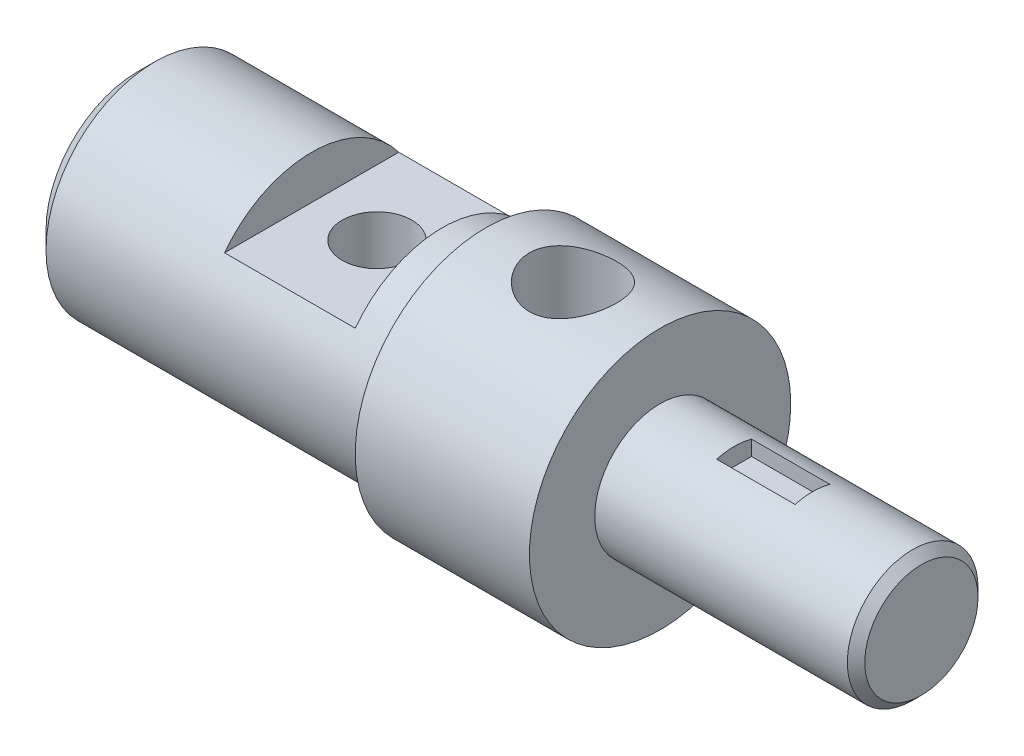
ISO-10303-21;
HEADER;
FILE_DESCRIPTION(('STEP AP214'),'2;1');
FILE_NAME('part.step','',(''),(''),'','','');
FILE_SCHEMA(('AUTOMOTIVE_DESIGN { 1 0 10303 214 1 1 1 1 }'));
ENDSEC;
DATA;
#1=APPLICATION_CONTEXT('core data for automotive mechanical design processes');
#2=APPLICATION_PROTOCOL_DEFINITION('international standard','automotive_design',2000,#1);
#3=PRODUCT_CONTEXT('',#1,'mechanical');
#4=PRODUCT('Part','Part','',(#3));
#5=PRODUCT_RELATED_PRODUCT_CATEGORY('part','',(#4));
#6=PRODUCT_DEFINITION_FORMATION('','',#4);
#7=PRODUCT_DEFINITION_CONTEXT('part definition',#1,'design');
#8=PRODUCT_DEFINITION('design','',#6,#7);
#9=PRODUCT_DEFINITION_SHAPE('','',#8);
#10=(LENGTH_UNIT() NAMED_UNIT(*) SI_UNIT(.MILLI.,.METRE.));
#11=(NAMED_UNIT(*) PLANE_ANGLE_UNIT() SI_UNIT($,.RADIAN.));
#12=(NAMED_UNIT(*) SI_UNIT($,.STERADIAN.) SOLID_ANGLE_UNIT());
#13=UNCERTAINTY_MEASURE_WITH_UNIT(LENGTH_MEASURE(1.E-05),#10,'distance_accuracy_value','');
#14=(GEOMETRIC_REPRESENTATION_CONTEXT(3) GLOBAL_UNCERTAINTY_ASSIGNED_CONTEXT((#13)) GLOBAL_UNIT_ASSIGNED_CONTEXT((#10,
#11,#12)) REPRESENTATION_CONTEXT('',''));
#15=CARTESIAN_POINT('',(0.,0.,0.));
#16=DIRECTION('',(0.,0.,1.));
#17=DIRECTION('',(1.,0.,0.));
#18=AXIS2_PLACEMENT_3D('',#15,#16,#17);
#19=CARTESIAN_POINT('',(0.,0.,0.));
#20=DIRECTION('',(-1.,0.,0.));
#21=DIRECTION('',(0.,0.,1.));
#22=AXIS2_PLACEMENT_3D('',#19,#20,#21);
#23=PLANE('',#22);
#24=CARTESIAN_POINT('',(0.,0.,0.));
#25=DIRECTION('',(-1.,0.,0.));
#26=DIRECTION('',(0.,0.,1.));
#27=AXIS2_PLACEMENT_3D('',#24,#25,#26);
#28=CIRCLE('',#27,21.);
#29=CARTESIAN_POINT('',(0.,0.,21.));
#30=VERTEX_POINT('',#29);
#31=EDGE_CURVE('E11',#30,#30,#28,.T.);
#32=ORIENTED_EDGE('',*,*,#31,.T.);
#33=EDGE_LOOP('',(#32));
#34=FACE_BOUND('',#33,.T.);
#35=ADVANCED_FACE('F32',(#34),#23,.T.);
#36=CARTESIAN_POINT('',(0.,0.,0.));
#37=DIRECTION('',(1.,0.,0.));
#38=DIRECTION('',(0.,0.,-1.));
#39=AXIS2_PLACEMENT_3D('',#36,#37,#38);
#40=CYLINDRICAL_SURFACE('',#39,25.);
#41=CARTESIAN_POINT('',(4.00000000000003,0.,0.));
#42=DIRECTION('',(-1.,0.,0.));
#43=DIRECTION('',(0.,0.,1.));
#44=AXIS2_PLACEMENT_3D('',#41,#42,#43);
#45=CIRCLE('',#44,25.);
#46=CARTESIAN_POINT('',(4.00000000000003,0.,25.));
#47=VERTEX_POINT('',#46);
#48=EDGE_CURVE('E40',#47,#47,#45,.F.);
#49=ORIENTED_EDGE('',*,*,#48,.T.);
#50=EDGE_LOOP('',(#49));
#51=FACE_BOUND('',#50,.T.);
#52=CARTESIAN_POINT('',(55.,-23.685438564654,8.00000000000001));
#53=CARTESIAN_POINT('',(54.7815803575144,-23.6854386808648,7.99999984957895));
#54=CARTESIAN_POINT('',(54.5631583241206,-23.6884680732668,7.99104739522468));
#55=CARTESIAN_POINT('',(54.1279420480163,-23.7004886386032,7.95532466127356));
#56=CARTESIAN_POINT('',(53.9111478298571,-23.7094799012743,7.92855411348258));
#57=CARTESIAN_POINT('',(53.4807765209476,-23.7331386878374,7.85745049211899));
#58=CARTESIAN_POINT('',(53.2671994309225,-23.7478062130085,7.81311741458832));
#59=CARTESIAN_POINT('',(52.8446965225023,-23.7823668675693,7.70727713375418));
#60=CARTESIAN_POINT('',(52.6357725455734,-23.8022620272859,7.64576325712626));
#61=CARTESIAN_POINT('',(52.2245298568912,-23.8466255896338,7.50625010454698));
#62=CARTESIAN_POINT('',(52.0221972775799,-23.8710835495518,7.42828841980156));
#63=CARTESIAN_POINT('',(51.6249122191686,-23.9238870822497,7.25642411726833));
#64=CARTESIAN_POINT('',(51.4299625574611,-23.9522341204386,7.16251548746745));
#65=CARTESIAN_POINT('',(50.8581469336224,-24.0419138600675,6.85793629516375));
#66=CARTESIAN_POINT('',(50.493962319828,-24.1079252956509,6.62429224651447));
#67=CARTESIAN_POINT('',(49.7973644234584,-24.2476140916892,6.09348517787802));
#68=CARTESIAN_POINT('',(49.466378758206,-24.3214714988789,5.7944955492848));
#69=CARTESIAN_POINT('',(49.010501101048,-24.4305604336787,5.30805806180979));
#70=CARTESIAN_POINT('',(48.8652345031396,-24.4666614836583,5.13947531148956));
#71=CARTESIAN_POINT('',(48.5891239511144,-24.5373497989682,4.79062429786665));
#72=CARTESIAN_POINT('',(48.4582746042002,-24.5719376273827,4.61036044424484));
#73=CARTESIAN_POINT('',(48.2088922034705,-24.6394882013786,4.2347279729649));
#74=CARTESIAN_POINT('',(48.0907355340008,-24.6723910632087,4.03909881022464));
#75=CARTESIAN_POINT('',(47.8714280071339,-24.7347020758086,3.63808475977613));
#76=CARTESIAN_POINT('',(47.7702708731147,-24.7641115152498,3.43270350884649));
#77=CARTESIAN_POINT('',(47.5857545385277,-24.8186071657323,3.01353634546636));
#78=CARTESIAN_POINT('',(47.5023954108645,-24.8436933590644,2.79975039859258));
#79=CARTESIAN_POINT('',(47.3542239569391,-24.8888108707868,2.36532685435552));
#80=CARTESIAN_POINT('',(47.2894109035082,-24.9088423873611,2.14468952600256));
#81=CARTESIAN_POINT('',(47.180728925036,-24.9427027645633,1.70544007064569));
#82=CARTESIAN_POINT('',(47.1362519370392,-24.956710833976,1.48699212530629));
#83=CARTESIAN_POINT('',(47.0656605262099,-24.9790435892772,1.04686465468346));
#84=CARTESIAN_POINT('',(47.0395454311426,-24.9873684832283,0.825185248008189));
#85=CARTESIAN_POINT('',(47.0059330560568,-24.9980969713181,0.380320164500186));
#86=CARTESIAN_POINT('',(46.9984321156355,-25.0005017296283,0.157134792466882));
#87=CARTESIAN_POINT('',(47.0021118069011,-24.9993242178161,-0.28906365753733));
#88=CARTESIAN_POINT('',(47.0132920435224,-24.9957420743034,-0.512076739052016));
#89=CARTESIAN_POINT('',(47.0534758054651,-24.9829322363409,-0.948121459241209));
#90=CARTESIAN_POINT('',(47.0818155131301,-24.9739148611172,-1.16122085959996));
#91=CARTESIAN_POINT('',(47.1554934591184,-24.9506525224548,-1.5842429569984));
#92=CARTESIAN_POINT('',(47.2008373589439,-24.9364058179578,-1.79416457175747));
#93=CARTESIAN_POINT('',(47.3081123786972,-24.9030628614678,-2.20925418899823));
#94=CARTESIAN_POINT('',(47.3700381560653,-24.8839681715628,-2.41442369948073));
#95=CARTESIAN_POINT('',(47.5099985337709,-24.8414105650832,-2.81880756880318));
#96=CARTESIAN_POINT('',(47.588039204788,-24.8179460026514,-3.01801965093511));
#97=CARTESIAN_POINT('',(47.7606557370643,-24.7669381755912,-3.41154230115595));
#98=CARTESIAN_POINT('',(47.8554216336045,-24.7393486620652,-3.6057634723955));
#99=CARTESIAN_POINT('',(48.0601508039592,-24.681002406741,-3.98560664410535));
#100=CARTESIAN_POINT('',(48.170119284338,-24.6502445807863,-4.17122566931733));
#101=CARTESIAN_POINT('',(48.4044713517015,-24.5863436093405,-4.53270352451581));
#102=CARTESIAN_POINT('',(48.5288555731446,-24.5532003588876,-4.70856192441846));
#103=CARTESIAN_POINT('',(48.7912304060849,-24.4853581392628,-5.04950040506669));
#104=CARTESIAN_POINT('',(48.9292214723438,-24.4506591181159,-5.21458012526541));
#105=CARTESIAN_POINT('',(49.224294765057,-24.3790361534028,-5.53999615080865));
#106=CARTESIAN_POINT('',(49.3819484959968,-24.3420813307925,-5.69980789139332));
#107=CARTESIAN_POINT('',(49.7101016069825,-24.2684460367681,-6.00560235549347));
#108=CARTESIAN_POINT('',(49.8805969015458,-24.2317654821453,-6.15158944417049));
#109=CARTESIAN_POINT('',(50.233509153091,-24.1596686679399,-6.42891535142167));
#110=CARTESIAN_POINT('',(50.415932066845,-24.1242530539452,-6.56024676080872));
#111=CARTESIAN_POINT('',(50.7914143392303,-24.055729897642,-6.80722281220515));
#112=CARTESIAN_POINT('',(50.9844695103839,-24.0226214581356,-6.92287356873054));
#113=CARTESIAN_POINT('',(51.3825721713507,-23.9592714476214,-7.13905927828408));
#114=CARTESIAN_POINT('',(51.5877408210363,-23.9290716234423,-7.23938361928213));
#115=CARTESIAN_POINT('',(52.0063215593138,-23.8729789265058,-7.42226578397705));
#116=CARTESIAN_POINT('',(52.2197302130904,-23.8470842825312,-7.50483091821093));
#117=CARTESIAN_POINT('',(52.6533276958522,-23.800429138452,-7.65150322946081));
#118=CARTESIAN_POINT('',(52.8735158493688,-23.7796681287125,-7.71561223878846));
#119=CARTESIAN_POINT('',(53.3190300716208,-23.743975529647,-7.82476399336434));
#120=CARTESIAN_POINT('',(53.5443558995329,-23.7290436676779,-7.86980763035373));
#121=CARTESIAN_POINT('',(53.9888409338644,-23.7060174995229,-7.93889170576141));
#122=CARTESIAN_POINT('',(54.2078622710117,-23.697662621809,-7.96373400113701));
#123=CARTESIAN_POINT('',(54.6473536397787,-23.6870451499325,-7.99525936903906));
#124=CARTESIAN_POINT('',(54.8678236307973,-23.6847823857512,-8.00194294833893));
#125=CARTESIAN_POINT('',(55.3085057308031,-23.6864229191965,-7.99708539580729));
#126=CARTESIAN_POINT('',(55.5287178729785,-23.6903253090695,-7.98554694697623));
#127=CARTESIAN_POINT('',(55.9672481872955,-23.7041671395069,-7.94436471462869));
#128=CARTESIAN_POINT('',(56.1855663793959,-23.7141065163736,-7.91472112214365));
#129=CARTESIAN_POINT('',(56.6119579936969,-23.7393032496007,-7.83881510596476));
#130=CARTESIAN_POINT('',(56.8201390515345,-23.7543859299533,-7.7930971836533));
#131=CARTESIAN_POINT('',(57.2318764618395,-23.7894762366902,-7.68531262760813));
#132=CARTESIAN_POINT('',(57.4354311436776,-23.8094856122303,-7.62324018687687));
#133=CARTESIAN_POINT('',(57.8364795153303,-23.8538445483664,-7.48328019357438));
#134=CARTESIAN_POINT('',(58.0339746556081,-23.878193060658,-7.40539646026721));
#135=CARTESIAN_POINT('',(58.4218204691984,-23.9305644078881,-7.23436820024294));
#136=CARTESIAN_POINT('',(58.612168399891,-23.9585886351545,-7.14121788732929));
#137=CARTESIAN_POINT('',(58.9900122130826,-24.0184175302227,-6.93737893981404));
#138=CARTESIAN_POINT('',(59.1772595043725,-24.0503091521117,-6.82625501208183));
#139=CARTESIAN_POINT('',(59.541870176719,-24.1163102267659,-6.58928737769675));
#140=CARTESIAN_POINT('',(59.719230112405,-24.1504204437669,-6.46343858673973));
#141=CARTESIAN_POINT('',(60.0629783261203,-24.219938268401,-6.19785668923714));
#142=CARTESIAN_POINT('',(60.2293658236983,-24.2553459680439,-6.05812259682145));
#143=CARTESIAN_POINT('',(60.5501889981145,-24.3265313336776,-5.76563306048304));
#144=CARTESIAN_POINT('',(60.7046244286207,-24.3623090072765,-5.6128773483211));
#145=CARTESIAN_POINT('',(61.0071453658597,-24.4348785274942,-5.28824824864535));
#146=CARTESIAN_POINT('',(61.1546520501366,-24.4716456851727,-5.11582929367889));
#147=CARTESIAN_POINT('',(61.4345900130402,-24.5435459979084,-4.75893573036775));
#148=CARTESIAN_POINT('',(61.5670263520449,-24.5786796990962,-4.57446520169249));
#149=CARTESIAN_POINT('',(61.8159796685336,-24.646363217685,-4.19452275928064));
#150=CARTESIAN_POINT('',(61.9324907444746,-24.6789120753393,-3.99904680486517));
#151=CARTESIAN_POINT('',(62.1485921125172,-24.7404858816269,-3.59852554329833));
#152=CARTESIAN_POINT('',(62.2481894527291,-24.7695122966486,-3.39348426773368));
#153=CARTESIAN_POINT('',(62.4290834785191,-24.8230510612467,-2.97657551943914));
#154=CARTESIAN_POINT('',(62.5104991135776,-24.8475925480298,-2.76476344195047));
#155=CARTESIAN_POINT('',(62.6551364957877,-24.8916927648829,-2.33459892745281));
#156=CARTESIAN_POINT('',(62.7183654471358,-24.9112534676118,-2.11624911815011));
#157=CARTESIAN_POINT('',(62.8260771739683,-24.9448363955662,-1.67456921077645));
#158=CARTESIAN_POINT('',(62.8705613544624,-24.9588590358908,-1.4512394872954));
#159=CARTESIAN_POINT('',(62.9403519065489,-24.9809545215066,-1.00131466158616));
#160=CARTESIAN_POINT('',(62.9656590262801,-24.9890275989028,-0.774719687093975));
#161=CARTESIAN_POINT('',(62.9961623768732,-24.9987683281904,-0.329977395751914));
#162=CARTESIAN_POINT('',(63.0021869382763,-25.0006997838081,-0.111892258699107));
#163=CARTESIAN_POINT('',(62.9964068589138,-24.9988502490425,0.324016073048196));
#164=CARTESIAN_POINT('',(62.9846025274623,-24.9950693577629,0.541839272221448));
#165=CARTESIAN_POINT('',(62.9432773332053,-24.9818989062369,0.975606985334868));
#166=CARTESIAN_POINT('',(62.9137578680302,-24.9725097884503,1.19155164611844));
#167=CARTESIAN_POINT('',(62.8372752895663,-24.9483780795732,1.62002344060835));
#168=CARTESIAN_POINT('',(62.7903121199832,-24.9336354712059,1.83255056328333));
#169=CARTESIAN_POINT('',(62.6801308987444,-24.8994319293148,2.24977742640648));
#170=CARTESIAN_POINT('',(62.6171475642325,-24.8800393414759,2.45454487231066));
#171=CARTESIAN_POINT('',(62.475118579292,-24.8369245375532,2.85803478911506));
#172=CARTESIAN_POINT('',(62.3960675544478,-24.8132008730564,3.056755211734));
#173=CARTESIAN_POINT('',(62.2225332612826,-24.7620297349124,3.44682151125832));
#174=CARTESIAN_POINT('',(62.1280509363013,-24.7345824889109,3.63816783807064));
#175=CARTESIAN_POINT('',(61.9243291578646,-24.6766448416532,4.0123624500628));
#176=CARTESIAN_POINT('',(61.8150887917887,-24.6461542522305,4.19521020876026));
#177=CARTESIAN_POINT('',(61.5785157983897,-24.5817710417011,4.55758428605791));
#178=CARTESIAN_POINT('',(61.4506835220378,-24.5477966714204,4.73676999619454));
#179=CARTESIAN_POINT('',(61.1808642675638,-24.4782780191123,5.08382063976728));
#180=CARTESIAN_POINT('',(61.0388770171924,-24.4427337068969,5.25168535535727));
#181=CARTESIAN_POINT('',(60.7416078750075,-24.3709920707552,5.57514131311731));
#182=CARTESIAN_POINT('',(60.5863220856443,-24.3347945578585,5.73072893125489));
#183=CARTESIAN_POINT('',(60.263442677397,-24.2627094461161,6.02863349136985));
#184=CARTESIAN_POINT('',(60.0958491973305,-24.2268218437801,6.17095058298368));
#185=CARTESIAN_POINT('',(59.7431926221287,-24.1550622480473,6.44623280732129));
#186=CARTESIAN_POINT('',(59.5577205645493,-24.1192360364833,6.57868658762253));
#187=CARTESIAN_POINT('',(59.1758986017667,-24.0500083393164,6.82742754976547));
#188=CARTESIAN_POINT('',(58.9795525498093,-24.0166060043738,6.9437204076819));
#189=CARTESIAN_POINT('',(58.5772254645046,-23.9532271614362,7.15929721420153));
#190=CARTESIAN_POINT('',(58.3712453803544,-23.9232503169413,7.25858283397506));
#191=CARTESIAN_POINT('',(57.9510447000177,-23.8676625416742,7.43933021995585));
#192=CARTESIAN_POINT('',(57.736824703956,-23.8420512936845,7.52079328132644));
#193=CARTESIAN_POINT('',(57.3171705108778,-23.7976656616538,7.66003007007605));
#194=CARTESIAN_POINT('',(57.1121956853139,-23.7785344826746,7.71907691819992));
#195=CARTESIAN_POINT('',(56.6978042823536,-23.7453132126206,7.82067534003812));
#196=CARTESIAN_POINT('',(56.4883880369382,-23.7312227461667,7.86322814207467));
#197=CARTESIAN_POINT('',(56.0665773948974,-23.7085058402604,7.93145930797294));
#198=CARTESIAN_POINT('',(55.8541836825504,-23.6998781657341,7.95714148613656));
#199=CARTESIAN_POINT('',(55.4278607698578,-23.6883444004375,7.99141211668505));
#200=CARTESIAN_POINT('',(55.2139315317591,-23.6854384508312,8.00000014733019));
#201=CARTESIAN_POINT('',(55.,-23.685438564654,8.00000000000001));
#202=B_SPLINE_CURVE_WITH_KNOTS('',3,(#52,#53,#54,#55,#56,#57,#58,#59,#60,#61,#62,#63,#64,#65,
#66,#67,#68,#69,#70,#71,#72,#73,#74,#75,#76,#77,#78,#79,#80,#81,#82,#83,#84,#85,#86,#87,#88,#89,
#90,#91,#92,#93,#94,#95,#96,#97,#98,#99,#100,#101,#102,#103,#104,#105,#106,#107,#108,#109,#110,
#111,#112,#113,#114,#115,#116,#117,#118,#119,#120,#121,#122,#123,#124,#125,#126,#127,#128,#129,
#130,#131,#132,#133,#134,#135,#136,#137,#138,#139,#140,#141,#142,#143,#144,#145,#146,#147,#148,
#149,#150,#151,#152,#153,#154,#155,#156,#157,#158,#159,#160,#161,#162,#163,#164,#165,#166,#167,
#168,#169,#170,#171,#172,#173,#174,#175,#176,#177,#178,#179,#180,#181,#182,#183,#184,#185,#186,
#187,#188,#189,#190,#191,#192,#193,#194,#195,#196,#197,#198,#199,#200,#201),.UNSPECIFIED.,.T.,
.F.,(4,2,2,2,2,2,2,2,2,2,2,2,2,2,2,2,2,2,2,2,2,2,2,2,2,2,2,2,2,2,2,2,2,2,2,2,2,2,2,2,2,2,2,2,2,
2,2,2,2,2,2,2,2,2,2,2,2,2,2,2,2,2,2,2,2,2,2,2,2,2,2,2,2,2,4),(0.,0.655059626466937,
1.31012911297413,1.96519874711431,2.62052317651381,3.27436579026311,3.92845545276966,
5.23552596387027,6.58532065165101,7.26102103756147,7.93646781235462,8.62832191041121,
9.3199199959852,10.0115209144469,10.7030947123741,11.3723642470032,12.0416092781852,
12.7107226944427,13.379821960613,14.0245575199928,14.6695079332943,15.3142507978025,
15.9592369894635,16.6120885536783,17.2651642622509,17.9182687245846,18.5713950220844,
19.253131912357,19.9346528200399,20.6165167248811,21.2981139742046,21.9883670561084,
22.6783354507936,23.3682353222403,24.0581029215598,24.7190289456479,25.379936524424,
26.0407468006384,26.7015501046149,27.3418387875787,27.9823551248959,28.6227169273145,
29.2633219973532,29.9227705177049,30.5824474127847,31.2421711790877,31.9019085386744,
32.5906888581722,33.279237209635,33.9680400337648,34.6565551192825,35.3404244347917,
36.0240224784454,36.7075692740596,37.3910894016541,38.0448231841301,38.6985456250823,
39.3522164975664,40.0058894795917,40.6504875552268,41.2953015956814,41.9400762323772,
42.5848907594693,43.2522885730135,43.9196992254095,44.5873061570479,45.254905559941,
45.9462048365877,46.6372606965966,47.3282486128662,48.0191862984298,48.6609628012668,
49.3026915014081,49.944275062267,50.5858744518131),.UNSPECIFIED.);
#203=CARTESIAN_POINT('',(55.,-23.685438564654,8.00000000000001));
#204=VERTEX_POINT('',#203);
#205=EDGE_CURVE('E122',#204,#204,#202,.T.);
#206=ORIENTED_EDGE('',*,*,#205,.F.);
#207=EDGE_LOOP('',(#206));
#208=FACE_BOUND('',#207,.T.);
#209=DIRECTION('',(1.,0.,0.));
#210=VECTOR('',#209,1.);
#211=CARTESIAN_POINT('',(0.,15.,-20.));
#212=LINE('',#211,#210);
#213=CARTESIAN_POINT('',(70.,15.,-20.));
#214=VERTEX_POINT('',#213);
#215=CARTESIAN_POINT('',(40.,15.,-20.));
#216=VERTEX_POINT('',#215);
#217=EDGE_CURVE('E232',#214,#216,#212,.F.);
#218=ORIENTED_EDGE('',*,*,#217,.F.);
#219=CARTESIAN_POINT('',(70.,0.,0.));
#220=DIRECTION('',(1.,0.,0.));
#221=DIRECTION('',(0.,0.,-1.));
#222=AXIS2_PLACEMENT_3D('',#219,#220,#221);
#223=CIRCLE('',#222,25.);
#224=CARTESIAN_POINT('',(70.,15.,20.));
#225=VERTEX_POINT('',#224);
#226=EDGE_CURVE('E240',#225,#214,#223,.F.);
#227=ORIENTED_EDGE('',*,*,#226,.F.);
#228=DIRECTION('',(1.,0.,0.));
#229=VECTOR('',#228,1.);
#230=CARTESIAN_POINT('',(0.,15.,20.));
#231=LINE('',#230,#229);
#232=CARTESIAN_POINT('',(40.,15.,20.));
#233=VERTEX_POINT('',#232);
#234=EDGE_CURVE('E237',#233,#225,#231,.T.);
#235=ORIENTED_EDGE('',*,*,#234,.F.);
#236=CARTESIAN_POINT('',(40.,0.,0.));
#237=DIRECTION('',(-1.,0.,0.));
#238=DIRECTION('',(0.,0.,1.));
#239=AXIS2_PLACEMENT_3D('',#236,#237,#238);
#240=CIRCLE('',#239,25.);
#241=EDGE_CURVE('E248',#216,#233,#240,.F.);
#242=ORIENTED_EDGE('',*,*,#241,.F.);
#243=EDGE_LOOP('',(#218,#227,#235,#242));
#244=FACE_BOUND('',#243,.T.);
#245=CARTESIAN_POINT('',(80.,0.,0.));
#246=DIRECTION('',(1.,0.,0.));
#247=DIRECTION('',(0.,0.,-1.));
#248=AXIS2_PLACEMENT_3D('',#245,#246,#247);
#249=CIRCLE('',#248,25.);
#250=CARTESIAN_POINT('',(80.,0.,-25.));
#251=VERTEX_POINT('',#250);
#252=EDGE_CURVE('E235',#251,#251,#249,.T.);
#253=ORIENTED_EDGE('',*,*,#252,.F.);
#254=EDGE_LOOP('',(#253));
#255=FACE_BOUND('',#254,.T.);
#256=ADVANCED_FACE('F132',(#51,#208,#244,#255),#40,.T.);
#257=CARTESIAN_POINT('',(80.,25.,0.));
#258=DIRECTION('',(-1.,0.,0.));
#259=DIRECTION('',(0.,0.,1.));
#260=AXIS2_PLACEMENT_3D('',#257,#258,#259);
#261=PLANE('',#260);
#262=ORIENTED_EDGE('',*,*,#252,.T.);
#263=EDGE_LOOP('',(#262));
#264=FACE_BOUND('',#263,.T.);
#265=CARTESIAN_POINT('',(80.,0.,0.));
#266=DIRECTION('',(1.,0.,0.));
#267=DIRECTION('',(0.,0.,-1.));
#268=AXIS2_PLACEMENT_3D('',#265,#266,#267);
#269=CIRCLE('',#268,30.);
#270=CARTESIAN_POINT('',(80.,0.,-30.));
#271=VERTEX_POINT('',#270);
#272=EDGE_CURVE('E238',#271,#271,#269,.T.);
#273=ORIENTED_EDGE('',*,*,#272,.F.);
#274=EDGE_LOOP('',(#273));
#275=FACE_BOUND('',#274,.T.);
#276=ADVANCED_FACE('F171',(#264,#275),#261,.T.);
#277=CARTESIAN_POINT('',(0.,0.,0.));
#278=DIRECTION('',(1.,0.,0.));
#279=DIRECTION('',(0.,0.,-1.));
#280=AXIS2_PLACEMENT_3D('',#277,#278,#279);
#281=CYLINDRICAL_SURFACE('',#280,30.);
#282=CARTESIAN_POINT('',(100.,28.2842712474619,9.99999999999999));
#283=CARTESIAN_POINT('',(100.272341879448,28.2842711586537,10.0000001140375));
#284=CARTESIAN_POINT('',(100.544682101367,28.2882153633986,9.98886524893429));
#285=CARTESIAN_POINT('',(101.087320156993,28.303863864854,9.9444377545498));
#286=CARTESIAN_POINT('',(101.357618005425,28.3155681055686,9.91114528515616));
#287=CARTESIAN_POINT('',(101.89422104605,28.3463631817862,9.82272262727792));
#288=CARTESIAN_POINT('',(102.160525709215,28.3654549871867,9.76758957136716));
#289=CARTESIAN_POINT('',(102.687222514007,28.4104260085242,9.63600126034045));
#290=CARTESIAN_POINT('',(102.947614604776,28.4363052828214,9.5595458218896));
#291=CARTESIAN_POINT('',(103.46016498503,28.4939998192805,9.38617562291734));
#292=CARTESIAN_POINT('',(103.712340097022,28.5258019239446,9.28930615037563));
#293=CARTESIAN_POINT('',(104.207545874165,28.594462376809,9.07575323466853));
#294=CARTESIAN_POINT('',(104.450573104353,28.6313226006317,8.95906243763902));
#295=CARTESIAN_POINT('',(104.925912805075,28.7090513785684,8.70676649822041));
#296=CARTESIAN_POINT('',(105.158225678627,28.749919781734,8.57116206803913));
#297=CARTESIAN_POINT('',(105.610819611248,28.8345602147077,8.28195822303535));
#298=CARTESIAN_POINT('',(105.831099935043,28.8783324215975,8.12835771032554));
#299=CARTESIAN_POINT('',(106.265972396708,28.969218118448,7.79837866412598));
#300=CARTESIAN_POINT('',(106.480084669694,29.0163950635917,7.6213849045367));
#301=CARTESIAN_POINT('',(106.892782734991,29.1113399914068,7.25028001156652));
#302=CARTESIAN_POINT('',(107.091368231117,29.1591079853326,7.05616855180181));
#303=CARTESIAN_POINT('',(107.471826206363,29.2539610336928,6.65198113288572));
#304=CARTESIAN_POINT('',(107.653695765004,29.3010459675826,6.44190239572425));
#305=CARTESIAN_POINT('',(107.999507438662,29.393270371731,6.00708268197571));
#306=CARTESIAN_POINT('',(108.163450089139,29.4384099000727,5.78234214364378));
#307=CARTESIAN_POINT('',(108.476372621772,29.5266957482028,5.31343875376166));
#308=CARTESIAN_POINT('',(108.624843363219,29.5697580123815,5.06891983241566));
#309=CARTESIAN_POINT('',(108.900512168664,29.6513369329531,4.56756881728998));
#310=CARTESIAN_POINT('',(109.027718627182,29.6898553813362,4.31074163421874));
#311=CARTESIAN_POINT('',(109.25985961834,29.7612633479985,3.78644812030809));
#312=CARTESIAN_POINT('',(109.364794139588,29.7941528633985,3.51898178402669));
#313=CARTESIAN_POINT('',(109.551431444854,29.8533415547454,2.97535495188021));
#314=CARTESIAN_POINT('',(109.633135223598,29.8796410128683,2.69919482883969));
#315=CARTESIAN_POINT('',(109.770093685946,29.9240820045263,2.15001211988423));
#316=CARTESIAN_POINT('',(109.82616962886,29.9424755162849,1.87721461619438));
#317=CARTESIAN_POINT('',(109.915405571331,29.9718782846619,1.32750200396552));
#318=CARTESIAN_POINT('',(109.948566054719,29.982887697186,1.05058698248876));
#319=CARTESIAN_POINT('',(109.991637669567,29.997206705667,0.494817637017554));
#320=CARTESIAN_POINT('',(110.001553954613,30.0005180084087,0.215963756651251));
#321=CARTESIAN_POINT('',(109.998051569216,29.9993505006877,-0.341577814177336));
#322=CARTESIAN_POINT('',(109.984633439028,29.9948718705828,-0.620265508337837));
#323=CARTESIAN_POINT('',(109.935584276264,29.9785811916692,-1.16440400781505));
#324=CARTESIAN_POINT('',(109.900846495794,29.9670641183686,-1.42994475599844));
#325=CARTESIAN_POINT('',(109.810280846866,29.9372641152287,-1.95700946299873));
#326=CARTESIAN_POINT('',(109.754453629906,29.9189813943948,-2.21853354563926));
#327=CARTESIAN_POINT('',(109.622209595331,29.8761277515145,-2.73574967788116));
#328=CARTESIAN_POINT('',(109.545795692015,29.8515577195385,-2.99144254740939));
#329=CARTESIAN_POINT('',(109.372981217217,29.7967458585561,-3.49545812020527));
#330=CARTESIAN_POINT('',(109.276573071463,29.7665018805459,-3.74377798954213));
#331=CARTESIAN_POINT('',(109.063191799455,29.7006905364675,-4.2345072896593));
#332=CARTESIAN_POINT('',(108.945972246202,29.6650602399235,-4.47680106526091));
#333=CARTESIAN_POINT('',(108.692659696252,29.5896554948147,-4.95074703653145));
#334=CARTESIAN_POINT('',(108.556559740601,29.5498795195829,-5.1823952663534));
#335=CARTESIAN_POINT('',(108.266458343477,29.467185279309,-5.63361428175613));
#336=CARTESIAN_POINT('',(108.112456136685,29.4242668799581,-5.85318455041525));
#337=CARTESIAN_POINT('',(107.787547005438,29.3363500324178,-6.27899992233789));
#338=CARTESIAN_POINT('',(107.616639465528,29.2913515085312,-6.4852445400158));
#339=CARTESIAN_POINT('',(107.250481215557,29.198230563107,-6.89268066334409));
#340=CARTESIAN_POINT('',(107.054461053244,29.150061110167,-7.09317055422096));
#341=CARTESIAN_POINT('',(106.646340061307,29.0539933119105,-7.47693750407165));
#342=CARTESIAN_POINT('',(106.434245948189,29.0060948622484,-7.66022168157002));
#343=CARTESIAN_POINT('',(105.995075364701,28.911847334422,-8.00859996283033));
#344=CARTESIAN_POINT('',(105.767990265706,28.8654991721175,-8.17368344194967));
#345=CARTESIAN_POINT('',(105.300433066685,28.775718676331,-8.4843478027125));
#346=CARTESIAN_POINT('',(105.059966326905,28.7322851904866,-8.62993641488595));
#347=CARTESIAN_POINT('',(104.563427936834,28.64898095839,-8.90261331003136));
#348=CARTESIAN_POINT('',(104.307178480291,28.6091721838022,-9.02939717143142));
#349=CARTESIAN_POINT('',(103.784188569667,28.5351208009343,-9.26075808434889));
#350=CARTESIAN_POINT('',(103.5174525259,28.5008758831323,-9.36534435549717));
#351=CARTESIAN_POINT('',(102.975319559119,28.439058164449,-9.55141833409385));
#352=CARTESIAN_POINT('',(102.699923754345,28.4114845060698,-9.63290901039165));
#353=CARTESIAN_POINT('',(102.14252340641,28.3639441097449,-9.77200545725044));
#354=CARTESIAN_POINT('',(101.860519204876,28.3439769794908,-9.82961245963079));
#355=CARTESIAN_POINT('',(101.304973467377,28.3130630141317,-9.91829437201929));
#356=CARTESIAN_POINT('',(101.031624364517,28.3017497645433,-9.9504493342463));
#357=CARTESIAN_POINT('',(100.482995076386,28.287066021394,-9.99211639711497));
#358=CARTESIAN_POINT('',(100.207714949387,28.2836952891803,-10.0016291780981));
#359=CARTESIAN_POINT('',(99.6573740214749,28.2850080810155,-9.99791579210809));
#360=CARTESIAN_POINT('',(99.3823131922071,28.2896902973743,-9.98469331703368));
#361=CARTESIAN_POINT('',(98.8344674952236,28.3069515740732,-9.93565128047109));
#362=CARTESIAN_POINT('',(98.5616825995672,28.3195305373233,-9.89983199680914));
#363=CARTESIAN_POINT('',(98.0298042567512,28.3516074081319,-9.80758102183026));
#364=CARTESIAN_POINT('',(97.7705637013315,28.3708507880741,-9.75190561796517));
#365=CARTESIAN_POINT('',(97.2577495174968,28.4157468336444,-9.62029948519906));
#366=CARTESIAN_POINT('',(97.0041779311516,28.4414017695639,-9.54436158082835));
#367=CARTESIAN_POINT('',(96.5044799532183,28.4983692386223,-9.37289185459437));
#368=CARTESIAN_POINT('',(96.2583517989269,28.529680419844,-9.27736471408096));
#369=CARTESIAN_POINT('',(95.7748737754284,28.597103970113,-9.06740307580549));
#370=CARTESIAN_POINT('',(95.5375273417895,28.6332181933345,-8.95296127203321));
#371=CARTESIAN_POINT('',(95.0658014476826,28.710459557941,-8.70214104644033));
#372=CARTESIAN_POINT('',(94.8317473188572,28.7517082135721,-8.56518817614669));
#373=CARTESIAN_POINT('',(94.3758018385612,28.8371535148024,-8.2729531948445));
#374=CARTESIAN_POINT('',(94.1539159958621,28.8813514758506,-8.11766288088267));
#375=CARTESIAN_POINT('',(93.7236756816311,28.9715031084024,-7.78979500724482));
#376=CARTESIAN_POINT('',(93.5153217343163,29.0174568478142,-7.61721677850363));
#377=CARTESIAN_POINT('',(93.1133393005839,29.1099265934175,-7.25582239580803));
#378=CARTESIAN_POINT('',(92.9197111556612,29.1564426126195,-7.06700586549976));
#379=CARTESIAN_POINT('',(92.5393176180589,29.2510891603461,-6.66472112704176));
#380=CARTESIAN_POINT('',(92.3533374618238,29.2991889216562,-6.45050221786744));
#381=CARTESIAN_POINT('',(92.0001149407249,29.3933527827566,-6.00684695000575));
#382=CARTESIAN_POINT('',(91.8328658410932,29.4394176105782,-5.77741610832449));
#383=CARTESIAN_POINT('',(91.5181558106606,29.5282725260609,-5.30461980440383));
#384=CARTESIAN_POINT('',(91.3707026844815,29.5710613192953,-5.06124889988543));
#385=CARTESIAN_POINT('',(91.0968569085151,29.6521306466086,-4.56234364098343));
#386=CARTESIAN_POINT('',(90.970455395478,29.6904130759775,-4.3068144640906));
#387=CARTESIAN_POINT('',(90.7404305230089,29.7611781009394,-3.78690590920504));
#388=CARTESIAN_POINT('',(90.6366666176068,29.7936962331654,-3.5225936064366));
#389=CARTESIAN_POINT('',(90.4518195802299,29.8523040878082,-2.98545108537336));
#390=CARTESIAN_POINT('',(90.3707364736991,29.8783938030133,-2.71262085752322));
#391=CARTESIAN_POINT('',(90.2320439705428,29.9233798042344,-2.1605581377827));
#392=CARTESIAN_POINT('',(90.1744275615284,29.9422782390591,-1.88132758484043));
#393=CARTESIAN_POINT('',(90.0832142576388,29.9723335559029,-1.31856201646018));
#394=CARTESIAN_POINT('',(90.0496163286901,29.983490771206,-1.03502718687205));
#395=CARTESIAN_POINT('',(90.0077927119217,29.9973972888662,-0.47931926258284));
#396=CARTESIAN_POINT('',(89.9984478955139,30.0005173987915,-0.207239081052935));
#397=CARTESIAN_POINT('',(90.0019714741259,29.9993428126327,0.336755914294553));
#398=CARTESIAN_POINT('',(90.0148391277196,29.9950483640377,0.608670733328683));
#399=CARTESIAN_POINT('',(90.0626613555054,29.9791626520563,1.15030993875714));
#400=CARTESIAN_POINT('',(90.0976141388509,29.9675719803088,1.42003450095977));
#401=CARTESIAN_POINT('',(90.1892760283218,29.9374086079629,1.95536187856338));
#402=CARTESIAN_POINT('',(90.2459851902558,29.9188358894545,2.22096468338958));
#403=CARTESIAN_POINT('',(90.3795575535406,29.8755584356358,2.74194020770654));
#404=CARTESIAN_POINT('',(90.4560810580551,29.8509573983983,2.9974088239966));
#405=CARTESIAN_POINT('',(90.629081371371,29.7960968484284,3.5009694113178));
#406=CARTESIAN_POINT('',(90.7255652896824,29.7658353199086,3.7490587178722));
#407=CARTESIAN_POINT('',(90.9377063033216,29.7004207309351,4.23620216269845));
#408=CARTESIAN_POINT('',(91.0533620444964,29.6652680159862,4.47525693763802));
#409=CARTESIAN_POINT('',(91.3030139795065,29.5909339126644,4.94294527905782));
#410=CARTESIAN_POINT('',(91.4370113601066,29.551752263647,5.1715781699306));
#411=CARTESIAN_POINT('',(91.7277108863565,29.4688081519004,5.62534353485784));
#412=CARTESIAN_POINT('',(91.8850687990777,29.4249299528017,5.85003487702623));
#413=CARTESIAN_POINT('',(92.2174631447937,29.3350010427051,6.28547126835551));
#414=CARTESIAN_POINT('',(92.3924999321699,29.2889502881672,6.49621603781055));
#415=CARTESIAN_POINT('',(92.7591991680803,29.1958514949471,6.90258840131869));
#416=CARTESIAN_POINT('',(92.950866633753,29.148803158572,7.09821139954938));
#417=CARTESIAN_POINT('',(93.3496217678836,29.0549477346299,7.4731091297047));
#418=CARTESIAN_POINT('',(93.5567093046823,29.0081406450066,7.65238400118341));
#419=CARTESIAN_POINT('',(93.9935507015226,28.914186301541,8.00022249753155));
#420=CARTESIAN_POINT('',(94.2238763492309,28.8670984170591,8.16808498152002));
#421=CARTESIAN_POINT('',(94.6983400025417,28.7759175566602,8.48372301205399));
#422=CARTESIAN_POINT('',(94.942472808915,28.7318234669818,8.63150604933305));
#423=CARTESIAN_POINT('',(95.4430577217519,28.6479466892045,8.90593894197784));
#424=CARTESIAN_POINT('',(95.699509837713,28.6081640044294,9.03258878105096));
#425=CARTESIAN_POINT('',(96.2229973529307,28.5341661028133,9.26369799840206));
#426=CARTESIAN_POINT('',(96.4900321839125,28.4999505875266,9.36815856629791));
#427=CARTESIAN_POINT('',(97.0205145149407,28.439603815985,9.54974733148494));
#428=CARTESIAN_POINT('',(97.2835787908005,28.4131771013528,9.62789736827417));
#429=CARTESIAN_POINT('',(97.8158133997925,28.3672416792722,9.7624105998578));
#430=CARTESIAN_POINT('',(98.0849835205205,28.3477327315668,9.81877455129849));
#431=CARTESIAN_POINT('',(98.6274076768933,28.3162626414065,9.90916574585984));
#432=CARTESIAN_POINT('',(98.9006604964561,28.304299295539,9.94319950979857));
#433=CARTESIAN_POINT('',(99.4492761144348,28.2883036592247,9.98861653420381));
#434=CARTESIAN_POINT('',(99.72463890446,28.2842713372547,9.99999988469828));
#435=CARTESIAN_POINT('',(100.,28.2842712474619,9.99999999999999));
#436=B_SPLINE_CURVE_WITH_KNOTS('',3,(#282,#283,#284,#285,#286,#287,#288,#289,#290,#291,#292,
#293,#294,#295,#296,#297,#298,#299,#300,#301,#302,#303,#304,#305,#306,#307,#308,#309,#310,#311,
#312,#313,#314,#315,#316,#317,#318,#319,#320,#321,#322,#323,#324,#325,#326,#327,#328,#329,#330,
#331,#332,#333,#334,#335,#336,#337,#338,#339,#340,#341,#342,#343,#344,#345,#346,#347,#348,#349,
#350,#351,#352,#353,#354,#355,#356,#357,#358,#359,#360,#361,#362,#363,#364,#365,#366,#367,#368,
#369,#370,#371,#372,#373,#374,#375,#376,#377,#378,#379,#380,#381,#382,#383,#384,#385,#386,#387,
#388,#389,#390,#391,#392,#393,#394,#395,#396,#397,#398,#399,#400,#401,#402,#403,#404,#405,#406,
#407,#408,#409,#410,#411,#412,#413,#414,#415,#416,#417,#418,#419,#420,#421,#422,#423,#424,#425,
#426,#427,#428,#429,#430,#431,#432,#433,#434,#435),.UNSPECIFIED.,.T.,.F.,(4,2,2,2,2,2,2,2,2,2,2,
2,2,2,2,2,2,2,2,2,2,2,2,2,2,2,2,2,2,2,2,2,2,2,2,2,2,2,2,2,2,2,2,2,2,2,2,2,2,2,2,2,2,2,2,2,2,2,2,
2,2,2,2,2,2,2,2,2,2,2,2,2,2,2,2,2,4),(0.,0.8167680596072,1.63353022553851,2.4503996588184,
3.26727611595184,4.0823590813045,4.89774511187015,5.71310044671447,6.52850554988108,
7.37286999592245,8.21725054497379,9.0617783383429,9.90628089953093,10.7730733994815,
11.6395229027308,12.5059728491808,13.3723856892507,14.208656653563,15.0449099605402,
15.8809778400841,16.7170263626666,17.5202339571185,18.3234167408122,19.1264858838399,
19.9298598051697,20.74347212296,21.5573851233426,22.3713329311248,23.1853103823888,
24.0378278398089,24.889991015934,25.7426490367816,26.5949679354003,27.459853568185,
28.3243792700684,29.1887937900586,30.0531637216383,30.8785251225922,31.7038617231671,
32.5290643128742,33.3542567569691,34.1508897973456,34.9478053211231,35.7445306229922,
36.5415643916545,37.3635426098908,38.1858899294866,39.0082690873152,39.8306673105009,
40.6928533438219,41.5547283753545,42.4169422120339,43.2787921126042,44.1351284875122,
44.9914658230857,45.8475470772924,46.7035914722059,47.5193689812692,48.3351192611683,
49.1508034017131,49.9664896346322,50.7690241262023,51.5718449585705,52.3746091098771,
53.1774252272562,54.0098911655819,54.8423737943936,55.6751084453733,56.5078359871349,
57.3734004329108,58.2386410839163,59.1038824019739,59.9690773207395,60.795173483065,
61.6212409519029,62.4470670866299,63.272889938962),.UNSPECIFIED.);
#437=CARTESIAN_POINT('',(100.,28.2842712474619,9.99999999999999));
#438=VERTEX_POINT('',#437);
#439=EDGE_CURVE('E174',#438,#438,#436,.T.);
#440=ORIENTED_EDGE('',*,*,#439,.F.);
#441=EDGE_LOOP('',(#440));
#442=FACE_BOUND('',#441,.T.);
#443=ORIENTED_EDGE('',*,*,#272,.T.);
#444=EDGE_LOOP('',(#443));
#445=FACE_BOUND('',#444,.T.);
#446=CARTESIAN_POINT('',(120.,0.,0.));
#447=DIRECTION('',(1.,0.,0.));
#448=DIRECTION('',(0.,0.,-1.));
#449=AXIS2_PLACEMENT_3D('',#446,#447,#448);
#450=CIRCLE('',#449,30.);
#451=CARTESIAN_POINT('',(120.,0.,-30.));
#452=VERTEX_POINT('',#451);
#453=EDGE_CURVE('E243',#452,#452,#450,.T.);
#454=ORIENTED_EDGE('',*,*,#453,.F.);
#455=EDGE_LOOP('',(#454));
#456=FACE_BOUND('',#455,.T.);
#457=ADVANCED_FACE('F167',(#442,#445,#456),#281,.T.);
#458=CARTESIAN_POINT('',(120.,30.,0.));
#459=DIRECTION('',(1.,0.,0.));
#460=DIRECTION('',(0.,0.,-1.));
#461=AXIS2_PLACEMENT_3D('',#458,#459,#460);
#462=PLANE('',#461);
#463=ORIENTED_EDGE('',*,*,#453,.T.);
#464=EDGE_LOOP('',(#463));
#465=FACE_BOUND('',#464,.T.);
#466=CARTESIAN_POINT('',(120.,0.,0.));
#467=DIRECTION('',(1.,0.,0.));
#468=DIRECTION('',(0.,0.,-1.));
#469=AXIS2_PLACEMENT_3D('',#466,#467,#468);
#470=CIRCLE('',#469,15.);
#471=CARTESIAN_POINT('',(120.,0.,-15.));
#472=VERTEX_POINT('',#471);
#473=EDGE_CURVE('E389',#472,#472,#470,.T.);
#474=ORIENTED_EDGE('',*,*,#473,.F.);
#475=EDGE_LOOP('',(#474));
#476=FACE_BOUND('',#475,.T.);
#477=ADVANCED_FACE('F163',(#465,#476),#462,.T.);
#478=CARTESIAN_POINT('',(0.,0.,0.));
#479=DIRECTION('',(1.,0.,0.));
#480=DIRECTION('',(0.,0.,-1.));
#481=AXIS2_PLACEMENT_3D('',#478,#479,#480);
#482=CYLINDRICAL_SURFACE('',#481,15.);
#483=CARTESIAN_POINT('',(178.,0.,0.));
#484=DIRECTION('',(1.,0.,0.));
#485=DIRECTION('',(0.,0.,-1.));
#486=AXIS2_PLACEMENT_3D('',#483,#484,#485);
#487=CIRCLE('',#486,15.);
#488=CARTESIAN_POINT('',(178.,0.,-15.));
#489=VERTEX_POINT('',#488);
#490=EDGE_CURVE('E220',#489,#489,#487,.F.);
#491=ORIENTED_EDGE('',*,*,#490,.T.);
#492=EDGE_LOOP('',(#491));
#493=FACE_BOUND('',#492,.T.);
#494=DIRECTION('',(1.,0.,0.));
#495=VECTOR('',#494,1.);
#496=CARTESIAN_POINT('',(0.,14.456832294801,-4.));
#497=LINE('',#496,#495);
#498=CARTESIAN_POINT('',(137.,14.456832294801,-4.));
#499=VERTEX_POINT('',#498);
#500=CARTESIAN_POINT('',(155.,14.456832294801,-4.));
#501=VERTEX_POINT('',#500);
#502=EDGE_CURVE('E183',#499,#501,#497,.T.);
#503=ORIENTED_EDGE('',*,*,#502,.T.);
#504=CARTESIAN_POINT('',(155.,0.,0.));
#505=DIRECTION('',(1.,0.,0.));
#506=DIRECTION('',(0.,0.,-1.));
#507=AXIS2_PLACEMENT_3D('',#504,#505,#506);
#508=CIRCLE('',#507,15.);
#509=CARTESIAN_POINT('',(155.,14.456832294801,4.));
#510=VERTEX_POINT('',#509);
#511=EDGE_CURVE('E253',#510,#501,#508,.F.);
#512=ORIENTED_EDGE('',*,*,#511,.F.);
#513=DIRECTION('',(1.,0.,0.));
#514=VECTOR('',#513,1.);
#515=CARTESIAN_POINT('',(0.,14.456832294801,4.));
#516=LINE('',#515,#514);
#517=CARTESIAN_POINT('',(137.,14.456832294801,4.));
#518=VERTEX_POINT('',#517);
#519=EDGE_CURVE('E251',#518,#510,#516,.T.);
#520=ORIENTED_EDGE('',*,*,#519,.F.);
#521=CARTESIAN_POINT('',(137.,0.,0.));
#522=DIRECTION('',(-1.,0.,0.));
#523=DIRECTION('',(0.,0.,1.));
#524=AXIS2_PLACEMENT_3D('',#521,#522,#523);
#525=CIRCLE('',#524,15.);
#526=EDGE_CURVE('E254',#499,#518,#525,.F.);
#527=ORIENTED_EDGE('',*,*,#526,.F.);
#528=EDGE_LOOP('',(#503,#512,#520,#527));
#529=FACE_BOUND('',#528,.T.);
#530=ORIENTED_EDGE('',*,*,#473,.T.);
#531=EDGE_LOOP('',(#530));
#532=FACE_BOUND('',#531,.T.);
#533=ADVANCED_FACE('F159',(#493,#529,#532),#482,.T.);
#534=CARTESIAN_POINT('',(180.,15.,0.));
#535=DIRECTION('',(1.,0.,0.));
#536=DIRECTION('',(0.,0.,-1.));
#537=AXIS2_PLACEMENT_3D('',#534,#535,#536);
#538=PLANE('',#537);
#539=CARTESIAN_POINT('',(180.,0.,0.));
#540=DIRECTION('',(1.,0.,0.));
#541=DIRECTION('',(0.,0.,-1.));
#542=AXIS2_PLACEMENT_3D('',#539,#540,#541);
#543=CIRCLE('',#542,13.);
#544=CARTESIAN_POINT('',(180.,0.,-13.));
#545=VERTEX_POINT('',#544);
#546=EDGE_CURVE('E182',#545,#545,#543,.T.);
#547=ORIENTED_EDGE('',*,*,#546,.T.);
#548=EDGE_LOOP('',(#547));
#549=FACE_BOUND('',#548,.T.);
#550=ADVANCED_FACE('F155',(#549),#538,.T.);
#551=CARTESIAN_POINT('',(40.,25.,-30.));
#552=DIRECTION('',(-1.,0.,0.));
#553=DIRECTION('',(0.,0.,1.));
#554=AXIS2_PLACEMENT_3D('',#551,#552,#553);
#555=PLANE('',#554);
#556=DIRECTION('',(0.,0.,1.));
#557=VECTOR('',#556,1.);
#558=CARTESIAN_POINT('',(40.,15.,-30.));
#559=LINE('',#558,#557);
#560=EDGE_CURVE('E55',#216,#233,#559,.T.);
#561=ORIENTED_EDGE('',*,*,#560,.F.);
#562=ORIENTED_EDGE('',*,*,#241,.T.);
#563=EDGE_LOOP('',(#561,#562));
#564=FACE_BOUND('',#563,.T.);
#565=ADVANCED_FACE('F148',(#564),#555,.F.);
#566=CARTESIAN_POINT('',(70.,25.,-30.));
#567=DIRECTION('',(1.,0.,0.));
#568=DIRECTION('',(0.,0.,-1.));
#569=AXIS2_PLACEMENT_3D('',#566,#567,#568);
#570=PLANE('',#569);
#571=ORIENTED_EDGE('',*,*,#226,.T.);
#572=DIRECTION('',(0.,0.,1.));
#573=VECTOR('',#572,1.);
#574=CARTESIAN_POINT('',(70.,15.,-30.));
#575=LINE('',#574,#573);
#576=EDGE_CURVE('E130',#214,#225,#575,.T.);
#577=ORIENTED_EDGE('',*,*,#576,.T.);
#578=EDGE_LOOP('',(#571,#577));
#579=FACE_BOUND('',#578,.T.);
#580=ADVANCED_FACE('F145',(#579),#570,.F.);
#581=CARTESIAN_POINT('',(40.,15.,-30.));
#582=DIRECTION('',(0.,-1.,0.));
#583=DIRECTION('',(0.,0.,-1.));
#584=AXIS2_PLACEMENT_3D('',#581,#582,#583);
#585=PLANE('',#584);
#586=CARTESIAN_POINT('',(55.,15.,0.));
#587=DIRECTION('',(0.,1.,0.));
#588=DIRECTION('',(0.,0.,1.));
#589=AXIS2_PLACEMENT_3D('',#586,#587,#588);
#590=CIRCLE('',#589,8.00000000000001);
#591=CARTESIAN_POINT('',(55.,15.,8.00000000000001));
#592=VERTEX_POINT('',#591);
#593=EDGE_CURVE('E117',#592,#592,#590,.T.);
#594=ORIENTED_EDGE('',*,*,#593,.F.);
#595=EDGE_LOOP('',(#594));
#596=FACE_BOUND('',#595,.T.);
#597=ORIENTED_EDGE('',*,*,#217,.T.);
#598=ORIENTED_EDGE('',*,*,#560,.T.);
#599=ORIENTED_EDGE('',*,*,#234,.T.);
#600=ORIENTED_EDGE('',*,*,#576,.F.);
#601=EDGE_LOOP('',(#597,#598,#599,#600));
#602=FACE_BOUND('',#601,.T.);
#603=ADVANCED_FACE('F142',(#596,#602),#585,.F.);
#604=CARTESIAN_POINT('',(55.,-30.,0.));
#605=DIRECTION('',(0.,1.,0.));
#606=DIRECTION('',(0.,0.,1.));
#607=AXIS2_PLACEMENT_3D('',#604,#605,#606);
#608=CYLINDRICAL_SURFACE('',#607,8.00000000000001);
#609=ORIENTED_EDGE('',*,*,#205,.T.);
#610=EDGE_LOOP('',(#609));
#611=FACE_BOUND('',#610,.T.);
#612=ORIENTED_EDGE('',*,*,#593,.T.);
#613=EDGE_LOOP('',(#612));
#614=FACE_BOUND('',#613,.T.);
#615=ADVANCED_FACE('F136',(#611,#614),#608,.F.);
#616=CARTESIAN_POINT('',(137.,15.,-4.));
#617=DIRECTION('',(-1.,0.,0.));
#618=DIRECTION('',(0.,0.,1.));
#619=AXIS2_PLACEMENT_3D('',#616,#617,#618);
#620=PLANE('',#619);
#621=DIRECTION('',(0.,-1.,0.));
#622=VECTOR('',#621,1.);
#623=CARTESIAN_POINT('',(137.,15.,-4.));
#624=LINE('',#623,#622);
#625=CARTESIAN_POINT('',(137.,11.,-4.));
#626=VERTEX_POINT('',#625);
#627=EDGE_CURVE('E101',#499,#626,#624,.T.);
#628=ORIENTED_EDGE('',*,*,#627,.F.);
#629=ORIENTED_EDGE('',*,*,#526,.T.);
#630=DIRECTION('',(0.,-1.,0.));
#631=VECTOR('',#630,1.);
#632=CARTESIAN_POINT('',(137.,15.,4.));
#633=LINE('',#632,#631);
#634=CARTESIAN_POINT('',(137.,11.,4.));
#635=VERTEX_POINT('',#634);
#636=EDGE_CURVE('E47',#518,#635,#633,.T.);
#637=ORIENTED_EDGE('',*,*,#636,.T.);
#638=DIRECTION('',(0.,0.,1.));
#639=VECTOR('',#638,1.);
#640=CARTESIAN_POINT('',(137.,11.,-4.));
#641=LINE('',#640,#639);
#642=EDGE_CURVE('E109',#626,#635,#641,.T.);
#643=ORIENTED_EDGE('',*,*,#642,.F.);
#644=EDGE_LOOP('',(#628,#629,#637,#643));
#645=FACE_BOUND('',#644,.T.);
#646=ADVANCED_FACE('F141',(#645),#620,.F.);
#647=CARTESIAN_POINT('',(155.,15.,-4.));
#648=DIRECTION('',(1.,0.,0.));
#649=DIRECTION('',(0.,0.,-1.));
#650=AXIS2_PLACEMENT_3D('',#647,#648,#649);
#651=PLANE('',#650);
#652=ORIENTED_EDGE('',*,*,#511,.T.);
#653=DIRECTION('',(0.,1.,0.));
#654=VECTOR('',#653,1.);
#655=CARTESIAN_POINT('',(155.,15.,-4.));
#656=LINE('',#655,#654);
#657=CARTESIAN_POINT('',(155.,11.,-4.));
#658=VERTEX_POINT('',#657);
#659=EDGE_CURVE('E107',#658,#501,#656,.T.);
#660=ORIENTED_EDGE('',*,*,#659,.F.);
#661=DIRECTION('',(0.,0.,1.));
#662=VECTOR('',#661,1.);
#663=CARTESIAN_POINT('',(155.,11.,-4.));
#664=LINE('',#663,#662);
#665=CARTESIAN_POINT('',(155.,11.,4.));
#666=VERTEX_POINT('',#665);
#667=EDGE_CURVE('E115',#658,#666,#664,.T.);
#668=ORIENTED_EDGE('',*,*,#667,.T.);
#669=DIRECTION('',(0.,1.,0.));
#670=VECTOR('',#669,1.);
#671=CARTESIAN_POINT('',(155.,15.,4.));
#672=LINE('',#671,#670);
#673=EDGE_CURVE('E104',#666,#510,#672,.T.);
#674=ORIENTED_EDGE('',*,*,#673,.T.);
#675=EDGE_LOOP('',(#652,#660,#668,#674));
#676=FACE_BOUND('',#675,.T.);
#677=ADVANCED_FACE('F198',(#676),#651,.F.);
#678=CARTESIAN_POINT('',(137.,11.,-4.));
#679=DIRECTION('',(0.,-1.,0.));
#680=DIRECTION('',(1.,0.,0.));
#681=AXIS2_PLACEMENT_3D('',#678,#679,#680);
#682=PLANE('',#681);
#683=DIRECTION('',(1.,0.,0.));
#684=VECTOR('',#683,1.);
#685=CARTESIAN_POINT('',(137.,11.,4.));
#686=LINE('',#685,#684);
#687=EDGE_CURVE('E98',#635,#666,#686,.T.);
#688=ORIENTED_EDGE('',*,*,#687,.T.);
#689=ORIENTED_EDGE('',*,*,#667,.F.);
#690=DIRECTION('',(1.,0.,0.));
#691=VECTOR('',#690,1.);
#692=CARTESIAN_POINT('',(137.,11.,-4.));
#693=LINE('',#692,#691);
#694=EDGE_CURVE('E103',#626,#658,#693,.T.);
#695=ORIENTED_EDGE('',*,*,#694,.F.);
#696=ORIENTED_EDGE('',*,*,#642,.T.);
#697=EDGE_LOOP('',(#688,#689,#695,#696));
#698=FACE_BOUND('',#697,.T.);
#699=ADVANCED_FACE('F194',(#698),#682,.F.);
#700=CARTESIAN_POINT('',(0.,0.,-4.));
#701=DIRECTION('',(0.,0.,1.));
#702=DIRECTION('',(1.,0.,0.));
#703=AXIS2_PLACEMENT_3D('',#700,#701,#702);
#704=PLANE('',#703);
#705=ORIENTED_EDGE('',*,*,#627,.T.);
#706=ORIENTED_EDGE('',*,*,#694,.T.);
#707=ORIENTED_EDGE('',*,*,#659,.T.);
#708=ORIENTED_EDGE('',*,*,#502,.F.);
#709=EDGE_LOOP('',(#705,#706,#707,#708));
#710=FACE_BOUND('',#709,.T.);
#711=ADVANCED_FACE('F191',(#710),#704,.T.);
#712=CARTESIAN_POINT('',(0.,0.,4.));
#713=DIRECTION('',(0.,0.,1.));
#714=DIRECTION('',(1.,0.,0.));
#715=AXIS2_PLACEMENT_3D('',#712,#713,#714);
#716=PLANE('',#715);
#717=ORIENTED_EDGE('',*,*,#519,.T.);
#718=ORIENTED_EDGE('',*,*,#673,.F.);
#719=ORIENTED_EDGE('',*,*,#687,.F.);
#720=ORIENTED_EDGE('',*,*,#636,.F.);
#721=EDGE_LOOP('',(#717,#718,#719,#720));
#722=FACE_BOUND('',#721,.T.);
#723=ADVANCED_FACE('F91',(#722),#716,.F.);
#724=CARTESIAN_POINT('',(100.,-5.,0.));
#725=DIRECTION('',(0.,1.,0.));
#726=DIRECTION('',(0.,0.,1.));
#727=AXIS2_PLACEMENT_3D('',#724,#725,#726);
#728=CONICAL_SURFACE('',#727,9.99999999999998,1.02974425867666);
#729=CARTESIAN_POINT('',(100.,-11.0086061902756,0.));
#730=VERTEX_POINT('',#729);
#731=VERTEX_LOOP('',#730);
#732=FACE_BOUND('',#731,.T.);
#733=CARTESIAN_POINT('',(100.,-5.,0.));
#734=DIRECTION('',(0.,1.,0.));
#735=DIRECTION('',(0.,0.,1.));
#736=AXIS2_PLACEMENT_3D('',#733,#734,#735);
#737=CIRCLE('',#736,9.99999999999998);
#738=CARTESIAN_POINT('',(100.,-5.,9.99999999999998));
#739=VERTEX_POINT('',#738);
#740=EDGE_CURVE('E95',#739,#739,#737,.T.);
#741=ORIENTED_EDGE('',*,*,#740,.T.);
#742=EDGE_LOOP('',(#741));
#743=FACE_BOUND('',#742,.T.);
#744=ADVANCED_FACE('F87',(#732,#743),#728,.F.);
#745=CARTESIAN_POINT('',(100.,30.,0.));
#746=DIRECTION('',(0.,1.,0.));
#747=DIRECTION('',(0.,0.,1.));
#748=AXIS2_PLACEMENT_3D('',#745,#746,#747);
#749=CYLINDRICAL_SURFACE('',#748,9.99999999999999);
#750=ORIENTED_EDGE('',*,*,#439,.T.);
#751=EDGE_LOOP('',(#750));
#752=FACE_BOUND('',#751,.T.);
#753=ORIENTED_EDGE('',*,*,#740,.F.);
#754=EDGE_LOOP('',(#753));
#755=FACE_BOUND('',#754,.T.);
#756=ADVANCED_FACE('F90',(#752,#755),#749,.F.);
#757=CARTESIAN_POINT('',(180.,0.,0.));
#758=DIRECTION('',(-1.,0.,0.));
#759=DIRECTION('',(0.,0.,1.));
#760=AXIS2_PLACEMENT_3D('',#757,#758,#759);
#761=CONICAL_SURFACE('',#760,13.,0.785398163397445);
#762=ORIENTED_EDGE('',*,*,#490,.F.);
#763=EDGE_LOOP('',(#762));
#764=FACE_BOUND('',#763,.T.);
#765=ORIENTED_EDGE('',*,*,#546,.F.);
#766=EDGE_LOOP('',(#765));
#767=FACE_BOUND('',#766,.T.);
#768=ADVANCED_FACE('F188',(#764,#767),#761,.T.);
#769=CARTESIAN_POINT('',(4.00000000000003,0.,0.));
#770=DIRECTION('',(1.,0.,0.));
#771=DIRECTION('',(0.,0.,-1.));
#772=AXIS2_PLACEMENT_3D('',#769,#770,#771);
#773=CONICAL_SURFACE('',#772,25.,0.785398163397449);
#774=ORIENTED_EDGE('',*,*,#31,.F.);
#775=EDGE_LOOP('',(#774));
#776=FACE_BOUND('',#775,.T.);
#777=ORIENTED_EDGE('',*,*,#48,.F.);
#778=EDGE_LOOP('',(#777));
#779=FACE_BOUND('',#778,.T.);
#780=ADVANCED_FACE('F34',(#776,#779),#773,.T.);
#781=CLOSED_SHELL('',(#35,#256,#276,#457,#477,#533,#550,#565,#580,#603,#615,#646,#677,#699,#711,
#723,#744,#756,#768,#780));
#782=MANIFOLD_SOLID_BREP('B2',#781);
#783=ADVANCED_BREP_SHAPE_REPRESENTATION('',(#18,#782),#14);
#784=SHAPE_DEFINITION_REPRESENTATION(#9,#783);
ENDSEC;
END-ISO-10303-21;
